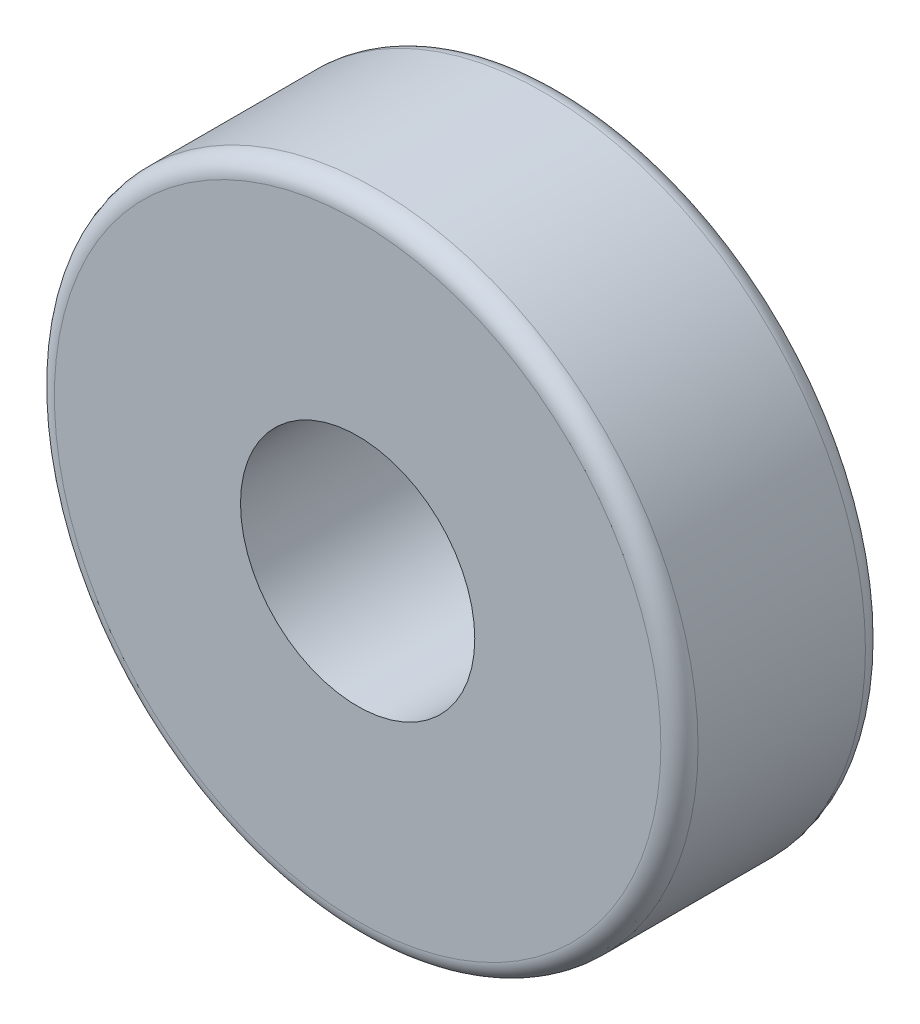
ISO-10303-21;
HEADER;
FILE_DESCRIPTION(('STEP AP214'),'2;1');
FILE_NAME('part.step','',(''),(''),'','','');
FILE_SCHEMA(('AUTOMOTIVE_DESIGN { 1 0 10303 214 1 1 1 1 }'));
ENDSEC;
DATA;
#1=APPLICATION_CONTEXT('core data for automotive mechanical design processes');
#2=APPLICATION_PROTOCOL_DEFINITION('international standard','automotive_design',2000,#1);
#3=PRODUCT_CONTEXT('',#1,'mechanical');
#4=PRODUCT('Part','Part','',(#3));
#5=PRODUCT_RELATED_PRODUCT_CATEGORY('part','',(#4));
#6=PRODUCT_DEFINITION_FORMATION('','',#4);
#7=PRODUCT_DEFINITION_CONTEXT('part definition',#1,'design');
#8=PRODUCT_DEFINITION('design','',#6,#7);
#9=PRODUCT_DEFINITION_SHAPE('','',#8);
#10=(LENGTH_UNIT() NAMED_UNIT(*) SI_UNIT(.MILLI.,.METRE.));
#11=(NAMED_UNIT(*) PLANE_ANGLE_UNIT() SI_UNIT($,.RADIAN.));
#12=(NAMED_UNIT(*) SI_UNIT($,.STERADIAN.) SOLID_ANGLE_UNIT());
#13=UNCERTAINTY_MEASURE_WITH_UNIT(LENGTH_MEASURE(1.E-05),#10,'distance_accuracy_value','');
#14=(GEOMETRIC_REPRESENTATION_CONTEXT(3) GLOBAL_UNCERTAINTY_ASSIGNED_CONTEXT((#13)) GLOBAL_UNIT_ASSIGNED_CONTEXT((#10,
#11,#12)) REPRESENTATION_CONTEXT('',''));
#15=CARTESIAN_POINT('',(0.,0.,0.));
#16=DIRECTION('',(0.,0.,1.));
#17=DIRECTION('',(1.,0.,0.));
#18=AXIS2_PLACEMENT_3D('',#15,#16,#17);
#19=CARTESIAN_POINT('',(0.,0.,6.985));
#20=DIRECTION('',(0.,0.,1.));
#21=DIRECTION('',(1.,0.,0.));
#22=AXIS2_PLACEMENT_3D('',#19,#20,#21);
#23=PLANE('',#22);
#24=CARTESIAN_POINT('',(0.,0.,6.985));
#25=DIRECTION('',(0.,0.,1.));
#26=DIRECTION('',(1.,0.,0.));
#27=AXIS2_PLACEMENT_3D('',#24,#25,#26);
#28=CIRCLE('',#27,10.35685);
#29=CARTESIAN_POINT('',(10.35685,0.,6.985));
#30=VERTEX_POINT('',#29);
#31=EDGE_CURVE('E10',#30,#30,#28,.T.);
#32=ORIENTED_EDGE('',*,*,#31,.T.);
#33=EDGE_LOOP('',(#32));
#34=FACE_BOUND('',#33,.T.);
#35=CARTESIAN_POINT('',(0.,0.,6.985));
#36=DIRECTION('',(0.,0.,1.));
#37=DIRECTION('',(1.,0.,0.));
#38=AXIS2_PLACEMENT_3D('',#35,#36,#37);
#39=CIRCLE('',#38,4.0005);
#40=CARTESIAN_POINT('',(4.0005,0.,6.985));
#41=VERTEX_POINT('',#40);
#42=EDGE_CURVE('E50',#41,#41,#39,.T.);
#43=ORIENTED_EDGE('',*,*,#42,.F.);
#44=EDGE_LOOP('',(#43));
#45=FACE_BOUND('',#44,.T.);
#46=ADVANCED_FACE('F30',(#34,#45),#23,.T.);
#47=CARTESIAN_POINT('',(0.,0.,0.));
#48=DIRECTION('',(0.,0.,1.));
#49=DIRECTION('',(1.,0.,0.));
#50=AXIS2_PLACEMENT_3D('',#47,#48,#49);
#51=PLANE('',#50);
#52=CARTESIAN_POINT('',(0.,0.,0.));
#53=DIRECTION('',(0.,0.,1.));
#54=DIRECTION('',(1.,0.,0.));
#55=AXIS2_PLACEMENT_3D('',#52,#53,#54);
#56=CIRCLE('',#55,10.35685);
#57=CARTESIAN_POINT('',(10.35685,0.,0.));
#58=VERTEX_POINT('',#57);
#59=EDGE_CURVE('E37',#58,#58,#56,.F.);
#60=ORIENTED_EDGE('',*,*,#59,.T.);
#61=EDGE_LOOP('',(#60));
#62=FACE_BOUND('',#61,.T.);
#63=CARTESIAN_POINT('',(0.,0.,0.));
#64=DIRECTION('',(0.,0.,1.));
#65=DIRECTION('',(1.,0.,0.));
#66=AXIS2_PLACEMENT_3D('',#63,#64,#65);
#67=CIRCLE('',#66,4.0005);
#68=CARTESIAN_POINT('',(4.0005,0.,0.));
#69=VERTEX_POINT('',#68);
#70=EDGE_CURVE('E51',#69,#69,#67,.T.);
#71=ORIENTED_EDGE('',*,*,#70,.T.);
#72=EDGE_LOOP('',(#71));
#73=FACE_BOUND('',#72,.T.);
#74=ADVANCED_FACE('F61',(#62,#73),#51,.F.);
#75=CARTESIAN_POINT('',(0.,0.,6.985));
#76=DIRECTION('',(0.,0.,-1.));
#77=DIRECTION('',(-1.,0.,0.));
#78=AXIS2_PLACEMENT_3D('',#75,#76,#77);
#79=CYLINDRICAL_SURFACE('',#78,10.99185);
#80=CARTESIAN_POINT('',(0.,0.,0.635));
#81=DIRECTION('',(0.,0.,1.));
#82=DIRECTION('',(1.,0.,0.));
#83=AXIS2_PLACEMENT_3D('',#80,#81,#82);
#84=CIRCLE('',#83,10.99185);
#85=CARTESIAN_POINT('',(10.99185,0.,0.635));
#86=VERTEX_POINT('',#85);
#87=EDGE_CURVE('E41',#86,#86,#84,.T.);
#88=ORIENTED_EDGE('',*,*,#87,.T.);
#89=EDGE_LOOP('',(#88));
#90=FACE_BOUND('',#89,.T.);
#91=CARTESIAN_POINT('',(0.,0.,6.35));
#92=DIRECTION('',(0.,0.,1.));
#93=DIRECTION('',(1.,0.,0.));
#94=AXIS2_PLACEMENT_3D('',#91,#92,#93);
#95=CIRCLE('',#94,10.99185);
#96=CARTESIAN_POINT('',(10.99185,0.,6.35));
#97=VERTEX_POINT('',#96);
#98=EDGE_CURVE('E45',#97,#97,#95,.F.);
#99=ORIENTED_EDGE('',*,*,#98,.T.);
#100=EDGE_LOOP('',(#99));
#101=FACE_BOUND('',#100,.T.);
#102=ADVANCED_FACE('F66',(#90,#101),#79,.T.);
#103=CARTESIAN_POINT('',(0.,0.,6.985));
#104=DIRECTION('',(0.,0.,-1.));
#105=DIRECTION('',(-1.,0.,0.));
#106=AXIS2_PLACEMENT_3D('',#103,#104,#105);
#107=CYLINDRICAL_SURFACE('',#106,4.0005);
#108=ORIENTED_EDGE('',*,*,#42,.T.);
#109=EDGE_LOOP('',(#108));
#110=FACE_BOUND('',#109,.T.);
#111=ORIENTED_EDGE('',*,*,#70,.F.);
#112=EDGE_LOOP('',(#111));
#113=FACE_BOUND('',#112,.T.);
#114=ADVANCED_FACE('F57',(#110,#113),#107,.F.);
#115=CARTESIAN_POINT('',(0.,0.,0.635));
#116=DIRECTION('',(0.,0.,1.));
#117=DIRECTION('',(1.,0.,0.));
#118=AXIS2_PLACEMENT_3D('',#115,#116,#117);
#119=TOROIDAL_SURFACE('',#118,10.35685,0.635);
#120=ORIENTED_EDGE('',*,*,#59,.F.);
#121=EDGE_LOOP('',(#120));
#122=FACE_BOUND('',#121,.T.);
#123=ORIENTED_EDGE('',*,*,#87,.F.);
#124=EDGE_LOOP('',(#123));
#125=FACE_BOUND('',#124,.T.);
#126=ADVANCED_FACE('F72',(#122,#125),#119,.T.);
#127=CARTESIAN_POINT('',(0.,0.,6.35));
#128=DIRECTION('',(0.,0.,1.));
#129=DIRECTION('',(1.,0.,0.));
#130=AXIS2_PLACEMENT_3D('',#127,#128,#129);
#131=TOROIDAL_SURFACE('',#130,10.35685,0.635);
#132=ORIENTED_EDGE('',*,*,#98,.F.);
#133=EDGE_LOOP('',(#132));
#134=FACE_BOUND('',#133,.T.);
#135=ORIENTED_EDGE('',*,*,#31,.F.);
#136=EDGE_LOOP('',(#135));
#137=FACE_BOUND('',#136,.T.);
#138=ADVANCED_FACE('F32',(#134,#137),#131,.T.);
#139=CLOSED_SHELL('',(#46,#74,#102,#114,#126,#138));
#140=MANIFOLD_SOLID_BREP('B2',#139);
#141=ADVANCED_BREP_SHAPE_REPRESENTATION('',(#18,#140),#14);
#142=SHAPE_DEFINITION_REPRESENTATION(#9,#141);
ENDSEC;
END-ISO-10303-21;
